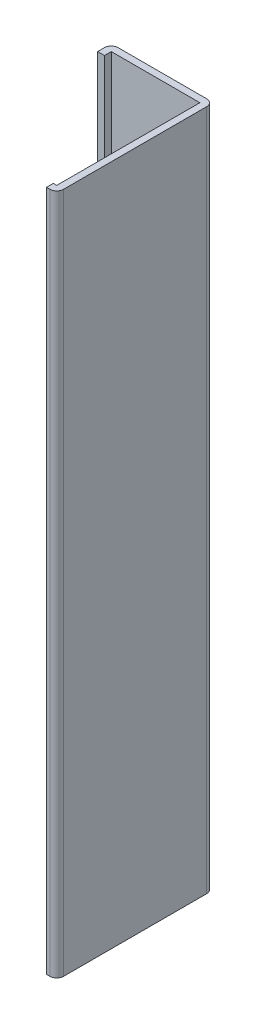
ISO-10303-21;
HEADER;
FILE_DESCRIPTION(('STEP AP214'),'2;1');
FILE_NAME('part.step','',(''),(''),'','','');
FILE_SCHEMA(('AUTOMOTIVE_DESIGN { 1 0 10303 214 1 1 1 1 }'));
ENDSEC;
DATA;
#1=APPLICATION_CONTEXT('core data for automotive mechanical design processes');
#2=APPLICATION_PROTOCOL_DEFINITION('international standard','automotive_design',2000,#1);
#3=PRODUCT_CONTEXT('',#1,'mechanical');
#4=PRODUCT('Part','Part','',(#3));
#5=PRODUCT_RELATED_PRODUCT_CATEGORY('part','',(#4));
#6=PRODUCT_DEFINITION_FORMATION('','',#4);
#7=PRODUCT_DEFINITION_CONTEXT('part definition',#1,'design');
#8=PRODUCT_DEFINITION('design','',#6,#7);
#9=PRODUCT_DEFINITION_SHAPE('','',#8);
#10=(LENGTH_UNIT() NAMED_UNIT(*) SI_UNIT(.MILLI.,.METRE.));
#11=(NAMED_UNIT(*) PLANE_ANGLE_UNIT() SI_UNIT($,.RADIAN.));
#12=(NAMED_UNIT(*) SI_UNIT($,.STERADIAN.) SOLID_ANGLE_UNIT());
#13=UNCERTAINTY_MEASURE_WITH_UNIT(LENGTH_MEASURE(1.E-05),#10,'distance_accuracy_value','');
#14=(GEOMETRIC_REPRESENTATION_CONTEXT(3) GLOBAL_UNCERTAINTY_ASSIGNED_CONTEXT((#13)) GLOBAL_UNIT_ASSIGNED_CONTEXT((#10,
#11,#12)) REPRESENTATION_CONTEXT('',''));
#15=CARTESIAN_POINT('',(0.,0.,0.));
#16=DIRECTION('',(0.,0.,1.));
#17=DIRECTION('',(1.,0.,0.));
#18=AXIS2_PLACEMENT_3D('',#15,#16,#17);
#19=CARTESIAN_POINT('',(-6.9088,-2.54,0.));
#20=DIRECTION('',(0.,0.,1.));
#21=DIRECTION('',(1.,0.,0.));
#22=AXIS2_PLACEMENT_3D('',#19,#20,#21);
#23=PLANE('',#22);
#24=DIRECTION('',(0.,-1.,0.));
#25=VECTOR('',#24,1.);
#26=CARTESIAN_POINT('',(-7.5692,-2.54,0.));
#27=LINE('',#26,#25);
#28=CARTESIAN_POINT('',(-7.5692,2.54,0.));
#29=VERTEX_POINT('',#28);
#30=CARTESIAN_POINT('',(-7.5692,-2.54,0.));
#31=VERTEX_POINT('',#30);
#32=EDGE_CURVE('E134',#29,#31,#27,.T.);
#33=ORIENTED_EDGE('',*,*,#32,.F.);
#34=DIRECTION('',(1.,0.,0.));
#35=VECTOR('',#34,1.);
#36=CARTESIAN_POINT('',(-6.9088,2.54,0.));
#37=LINE('',#36,#35);
#38=CARTESIAN_POINT('',(-6.9088,2.54,0.));
#39=VERTEX_POINT('',#38);
#40=EDGE_CURVE('E140',#39,#29,#37,.F.);
#41=ORIENTED_EDGE('',*,*,#40,.F.);
#42=DIRECTION('',(0.,-1.,0.));
#43=VECTOR('',#42,1.);
#44=CARTESIAN_POINT('',(-6.9088,-2.54,0.));
#45=LINE('',#44,#43);
#46=CARTESIAN_POINT('',(-6.9088,-2.54,0.));
#47=VERTEX_POINT('',#46);
#48=EDGE_CURVE('E119',#47,#39,#45,.F.);
#49=ORIENTED_EDGE('',*,*,#48,.F.);
#50=DIRECTION('',(1.,0.,0.));
#51=VECTOR('',#50,1.);
#52=CARTESIAN_POINT('',(-6.9088,-2.54,0.));
#53=LINE('',#52,#51);
#54=EDGE_CURVE('E114',#31,#47,#53,.T.);
#55=ORIENTED_EDGE('',*,*,#54,.F.);
#56=EDGE_LOOP('',(#33,#41,#49,#55));
#57=FACE_BOUND('',#56,.T.);
#58=ADVANCED_FACE('F17',(#57),#23,.F.);
#59=CARTESIAN_POINT('',(-6.9088,-2.54,0.0508));
#60=DIRECTION('',(0.,-1.,0.));
#61=DIRECTION('',(0.,0.,-1.));
#62=AXIS2_PLACEMENT_3D('',#59,#60,#61);
#63=CYLINDRICAL_SURFACE('',#62,0.0508);
#64=CARTESIAN_POINT('',(-6.9088,2.54,0.0508));
#65=DIRECTION('',(0.,-1.,0.));
#66=DIRECTION('',(0.,0.,-1.));
#67=AXIS2_PLACEMENT_3D('',#64,#65,#66);
#68=CIRCLE('',#67,0.0508);
#69=CARTESIAN_POINT('',(-6.858,2.54,0.0508));
#70=VERTEX_POINT('',#69);
#71=EDGE_CURVE('E131',#39,#70,#68,.T.);
#72=ORIENTED_EDGE('',*,*,#71,.T.);
#73=DIRECTION('',(0.,1.,0.));
#74=VECTOR('',#73,1.);
#75=CARTESIAN_POINT('',(-6.858,-2.54,0.0507999999999999));
#76=LINE('',#75,#74);
#77=CARTESIAN_POINT('',(-6.858,-2.54,0.0508));
#78=VERTEX_POINT('',#77);
#79=EDGE_CURVE('E123',#70,#78,#76,.F.);
#80=ORIENTED_EDGE('',*,*,#79,.T.);
#81=CARTESIAN_POINT('',(-6.9088,-2.54,0.0508));
#82=DIRECTION('',(0.,-1.,0.));
#83=DIRECTION('',(0.,0.,-1.));
#84=AXIS2_PLACEMENT_3D('',#81,#82,#83);
#85=CIRCLE('',#84,0.0508);
#86=EDGE_CURVE('E20',#78,#47,#85,.F.);
#87=ORIENTED_EDGE('',*,*,#86,.T.);
#88=ORIENTED_EDGE('',*,*,#48,.T.);
#89=EDGE_LOOP('',(#72,#80,#87,#88));
#90=FACE_BOUND('',#89,.T.);
#91=ADVANCED_FACE('F129',(#90),#63,.T.);
#92=CARTESIAN_POINT('',(-7.5692,-2.54,0.0508));
#93=DIRECTION('',(0.,-1.,0.));
#94=DIRECTION('',(0.,0.,-1.));
#95=AXIS2_PLACEMENT_3D('',#92,#93,#94);
#96=CYLINDRICAL_SURFACE('',#95,0.0508);
#97=CARTESIAN_POINT('',(-7.5692,2.54,0.0508));
#98=DIRECTION('',(0.,-1.,0.));
#99=DIRECTION('',(0.,0.,-1.));
#100=AXIS2_PLACEMENT_3D('',#97,#98,#99);
#101=CIRCLE('',#100,0.0508);
#102=CARTESIAN_POINT('',(-7.62,2.54,0.0508));
#103=VERTEX_POINT('',#102);
#104=EDGE_CURVE('E145',#103,#29,#101,.T.);
#105=ORIENTED_EDGE('',*,*,#104,.T.);
#106=ORIENTED_EDGE('',*,*,#32,.T.);
#107=CARTESIAN_POINT('',(-7.5692,-2.54,0.0508));
#108=DIRECTION('',(0.,-1.,0.));
#109=DIRECTION('',(0.,0.,-1.));
#110=AXIS2_PLACEMENT_3D('',#107,#108,#109);
#111=CIRCLE('',#110,0.0508);
#112=CARTESIAN_POINT('',(-7.62,-2.54,0.0508));
#113=VERTEX_POINT('',#112);
#114=EDGE_CURVE('E155',#31,#113,#111,.F.);
#115=ORIENTED_EDGE('',*,*,#114,.T.);
#116=DIRECTION('',(0.,1.,0.));
#117=VECTOR('',#116,1.);
#118=CARTESIAN_POINT('',(-7.62,-2.54,0.0508));
#119=LINE('',#118,#117);
#120=EDGE_CURVE('E127',#113,#103,#119,.T.);
#121=ORIENTED_EDGE('',*,*,#120,.T.);
#122=EDGE_LOOP('',(#105,#106,#115,#121));
#123=FACE_BOUND('',#122,.T.);
#124=ADVANCED_FACE('F159',(#123),#96,.T.);
#125=CARTESIAN_POINT('',(-6.858,-2.54,1.1176));
#126=DIRECTION('',(-1.,0.,0.));
#127=DIRECTION('',(0.,0.,1.));
#128=AXIS2_PLACEMENT_3D('',#125,#126,#127);
#129=PLANE('',#128);
#130=ORIENTED_EDGE('',*,*,#79,.F.);
#131=DIRECTION('',(0.,0.,1.));
#132=VECTOR('',#131,1.);
#133=CARTESIAN_POINT('',(-6.858,2.54,1.1176));
#134=LINE('',#133,#132);
#135=CARTESIAN_POINT('',(-6.858,2.54,1.1176));
#136=VERTEX_POINT('',#135);
#137=EDGE_CURVE('E132',#136,#70,#134,.F.);
#138=ORIENTED_EDGE('',*,*,#137,.F.);
#139=DIRECTION('',(0.,-1.,0.));
#140=VECTOR('',#139,1.);
#141=CARTESIAN_POINT('',(-6.858,-2.54,1.1176));
#142=LINE('',#141,#140);
#143=CARTESIAN_POINT('',(-6.858,-2.54,1.1176));
#144=VERTEX_POINT('',#143);
#145=EDGE_CURVE('E126',#144,#136,#142,.F.);
#146=ORIENTED_EDGE('',*,*,#145,.F.);
#147=DIRECTION('',(0.,0.,1.));
#148=VECTOR('',#147,1.);
#149=CARTESIAN_POINT('',(-6.858,-2.54,1.1176));
#150=LINE('',#149,#148);
#151=EDGE_CURVE('E111',#78,#144,#150,.T.);
#152=ORIENTED_EDGE('',*,*,#151,.F.);
#153=EDGE_LOOP('',(#130,#138,#146,#152));
#154=FACE_BOUND('',#153,.T.);
#155=ADVANCED_FACE('F122',(#154),#129,.F.);
#156=CARTESIAN_POINT('',(-7.62,-2.54,0.0508));
#157=DIRECTION('',(1.,0.,0.));
#158=DIRECTION('',(0.,0.,-1.));
#159=AXIS2_PLACEMENT_3D('',#156,#157,#158);
#160=PLANE('',#159);
#161=DIRECTION('',(0.,1.,0.));
#162=VECTOR('',#161,1.);
#163=CARTESIAN_POINT('',(-7.62,-2.54,0.1016));
#164=LINE('',#163,#162);
#165=CARTESIAN_POINT('',(-7.62,-2.54,0.1016));
#166=VERTEX_POINT('',#165);
#167=CARTESIAN_POINT('',(-7.62,2.54,0.1016));
#168=VERTEX_POINT('',#167);
#169=EDGE_CURVE('E150',#166,#168,#164,.T.);
#170=ORIENTED_EDGE('',*,*,#169,.T.);
#171=DIRECTION('',(0.,0.,-1.));
#172=VECTOR('',#171,1.);
#173=CARTESIAN_POINT('',(-7.62,2.54,0.0508));
#174=LINE('',#173,#172);
#175=EDGE_CURVE('E167',#103,#168,#174,.F.);
#176=ORIENTED_EDGE('',*,*,#175,.F.);
#177=ORIENTED_EDGE('',*,*,#120,.F.);
#178=DIRECTION('',(0.,0.,-1.));
#179=VECTOR('',#178,1.);
#180=CARTESIAN_POINT('',(-7.62,-2.54,0.0508));
#181=LINE('',#180,#179);
#182=EDGE_CURVE('E153',#166,#113,#181,.T.);
#183=ORIENTED_EDGE('',*,*,#182,.F.);
#184=EDGE_LOOP('',(#170,#176,#177,#183));
#185=FACE_BOUND('',#184,.T.);
#186=ADVANCED_FACE('F165',(#185),#160,.F.);
#187=CARTESIAN_POINT('',(-6.9088,-2.54,1.1176));
#188=DIRECTION('',(0.,-1.,0.));
#189=DIRECTION('',(0.,0.,-1.));
#190=AXIS2_PLACEMENT_3D('',#187,#188,#189);
#191=CYLINDRICAL_SURFACE('',#190,0.0508);
#192=CARTESIAN_POINT('',(-6.9088,2.54,1.1176));
#193=DIRECTION('',(0.,-1.,0.));
#194=DIRECTION('',(0.,0.,-1.));
#195=AXIS2_PLACEMENT_3D('',#192,#193,#194);
#196=CIRCLE('',#195,0.0508);
#197=CARTESIAN_POINT('',(-6.9088,2.54,1.1684));
#198=VERTEX_POINT('',#197);
#199=EDGE_CURVE('E148',#136,#198,#196,.T.);
#200=ORIENTED_EDGE('',*,*,#199,.T.);
#201=DIRECTION('',(0.,1.,0.));
#202=VECTOR('',#201,1.);
#203=CARTESIAN_POINT('',(-6.9088,-2.54,1.1684));
#204=LINE('',#203,#202);
#205=CARTESIAN_POINT('',(-6.9088,-2.54,1.1684));
#206=VERTEX_POINT('',#205);
#207=EDGE_CURVE('E181',#206,#198,#204,.T.);
#208=ORIENTED_EDGE('',*,*,#207,.F.);
#209=CARTESIAN_POINT('',(-6.9088,-2.54,1.1176));
#210=DIRECTION('',(0.,-1.,0.));
#211=DIRECTION('',(0.,0.,-1.));
#212=AXIS2_PLACEMENT_3D('',#209,#210,#211);
#213=CIRCLE('',#212,0.0508);
#214=EDGE_CURVE('E151',#206,#144,#213,.F.);
#215=ORIENTED_EDGE('',*,*,#214,.T.);
#216=ORIENTED_EDGE('',*,*,#145,.T.);
#217=EDGE_LOOP('',(#200,#208,#215,#216));
#218=FACE_BOUND('',#217,.T.);
#219=ADVANCED_FACE('F234',(#218),#191,.T.);
#220=CARTESIAN_POINT('',(-7.62,-2.54,0.1016));
#221=DIRECTION('',(0.,0.,-1.));
#222=DIRECTION('',(-1.,0.,0.));
#223=AXIS2_PLACEMENT_3D('',#220,#221,#222);
#224=PLANE('',#223);
#225=DIRECTION('',(0.,1.,0.));
#226=VECTOR('',#225,1.);
#227=CARTESIAN_POINT('',(-7.5692,-2.54,0.1016));
#228=LINE('',#227,#226);
#229=CARTESIAN_POINT('',(-7.5692,-2.54,0.1016));
#230=VERTEX_POINT('',#229);
#231=CARTESIAN_POINT('',(-7.5692,2.54,0.1016));
#232=VERTEX_POINT('',#231);
#233=EDGE_CURVE('E196',#230,#232,#228,.T.);
#234=ORIENTED_EDGE('',*,*,#233,.T.);
#235=DIRECTION('',(-1.,0.,0.));
#236=VECTOR('',#235,1.);
#237=CARTESIAN_POINT('',(-7.62,2.54,0.1016));
#238=LINE('',#237,#236);
#239=EDGE_CURVE('E177',#168,#232,#238,.F.);
#240=ORIENTED_EDGE('',*,*,#239,.F.);
#241=ORIENTED_EDGE('',*,*,#169,.F.);
#242=DIRECTION('',(-1.,0.,0.));
#243=VECTOR('',#242,1.);
#244=CARTESIAN_POINT('',(-7.62,-2.54,0.1016));
#245=LINE('',#244,#243);
#246=EDGE_CURVE('E170',#230,#166,#245,.T.);
#247=ORIENTED_EDGE('',*,*,#246,.F.);
#248=EDGE_LOOP('',(#234,#240,#241,#247));
#249=FACE_BOUND('',#248,.T.);
#250=ADVANCED_FACE('F202',(#249),#224,.F.);
#251=CARTESIAN_POINT('',(-6.9088,-2.54,1.1684));
#252=DIRECTION('',(0.,0.,1.));
#253=DIRECTION('',(1.,0.,0.));
#254=AXIS2_PLACEMENT_3D('',#251,#252,#253);
#255=PLANE('',#254);
#256=DIRECTION('',(0.,1.,0.));
#257=VECTOR('',#256,1.);
#258=CARTESIAN_POINT('',(-6.9342,-2.54,1.1684));
#259=LINE('',#258,#257);
#260=CARTESIAN_POINT('',(-6.9342,2.54,1.1684));
#261=VERTEX_POINT('',#260);
#262=CARTESIAN_POINT('',(-6.9342,-2.54,1.1684));
#263=VERTEX_POINT('',#262);
#264=EDGE_CURVE('E216',#261,#263,#259,.F.);
#265=ORIENTED_EDGE('',*,*,#264,.T.);
#266=DIRECTION('',(1.,0.,0.));
#267=VECTOR('',#266,1.);
#268=CARTESIAN_POINT('',(-6.9088,-2.54,1.1684));
#269=LINE('',#268,#267);
#270=EDGE_CURVE('E203',#263,#206,#269,.T.);
#271=ORIENTED_EDGE('',*,*,#270,.T.);
#272=ORIENTED_EDGE('',*,*,#207,.T.);
#273=DIRECTION('',(1.,0.,0.));
#274=VECTOR('',#273,1.);
#275=CARTESIAN_POINT('',(-6.9088,2.54,1.1684));
#276=LINE('',#275,#274);
#277=EDGE_CURVE('E206',#198,#261,#276,.F.);
#278=ORIENTED_EDGE('',*,*,#277,.T.);
#279=EDGE_LOOP('',(#265,#271,#272,#278));
#280=FACE_BOUND('',#279,.T.);
#281=ADVANCED_FACE('F240',(#280),#255,.T.);
#282=CARTESIAN_POINT('',(-7.5692,-2.54,0.1016));
#283=DIRECTION('',(-1.,0.,0.));
#284=DIRECTION('',(0.,0.,1.));
#285=AXIS2_PLACEMENT_3D('',#282,#283,#284);
#286=PLANE('',#285);
#287=DIRECTION('',(0.,1.,0.));
#288=VECTOR('',#287,1.);
#289=CARTESIAN_POINT('',(-7.5692,-2.54,0.0508));
#290=LINE('',#289,#288);
#291=CARTESIAN_POINT('',(-7.5692,-2.54,0.0508));
#292=VERTEX_POINT('',#291);
#293=CARTESIAN_POINT('',(-7.5692,2.54,0.0508));
#294=VERTEX_POINT('',#293);
#295=EDGE_CURVE('E198',#292,#294,#290,.T.);
#296=ORIENTED_EDGE('',*,*,#295,.T.);
#297=DIRECTION('',(0.,0.,1.));
#298=VECTOR('',#297,1.);
#299=CARTESIAN_POINT('',(-7.5692,2.54,0.1016));
#300=LINE('',#299,#298);
#301=EDGE_CURVE('E189',#232,#294,#300,.F.);
#302=ORIENTED_EDGE('',*,*,#301,.F.);
#303=ORIENTED_EDGE('',*,*,#233,.F.);
#304=DIRECTION('',(0.,0.,1.));
#305=VECTOR('',#304,1.);
#306=CARTESIAN_POINT('',(-7.5692,-2.54,0.1016));
#307=LINE('',#306,#305);
#308=EDGE_CURVE('E200',#292,#230,#307,.T.);
#309=ORIENTED_EDGE('',*,*,#308,.F.);
#310=EDGE_LOOP('',(#296,#302,#303,#309));
#311=FACE_BOUND('',#310,.T.);
#312=ADVANCED_FACE('F195',(#311),#286,.F.);
#313=CARTESIAN_POINT('',(-6.9342,-2.54,1.1176));
#314=DIRECTION('',(1.,0.,0.));
#315=DIRECTION('',(0.,0.,-1.));
#316=AXIS2_PLACEMENT_3D('',#313,#314,#315);
#317=PLANE('',#316);
#318=ORIENTED_EDGE('',*,*,#264,.F.);
#319=DIRECTION('',(0.,0.,1.));
#320=VECTOR('',#319,1.);
#321=CARTESIAN_POINT('',(-6.9342,2.54,0.0508));
#322=LINE('',#321,#320);
#323=CARTESIAN_POINT('',(-6.9342,2.54,1.1176));
#324=VERTEX_POINT('',#323);
#325=EDGE_CURVE('E226',#324,#261,#322,.T.);
#326=ORIENTED_EDGE('',*,*,#325,.F.);
#327=DIRECTION('',(0.,1.,0.));
#328=VECTOR('',#327,1.);
#329=CARTESIAN_POINT('',(-6.9342,-2.54,1.1176));
#330=LINE('',#329,#328);
#331=CARTESIAN_POINT('',(-6.9342,-2.54,1.1176));
#332=VERTEX_POINT('',#331);
#333=EDGE_CURVE('E246',#324,#332,#330,.F.);
#334=ORIENTED_EDGE('',*,*,#333,.T.);
#335=DIRECTION('',(0.,0.,-1.));
#336=VECTOR('',#335,1.);
#337=CARTESIAN_POINT('',(-6.9342,-2.54,1.1176));
#338=LINE('',#337,#336);
#339=EDGE_CURVE('E214',#263,#332,#338,.T.);
#340=ORIENTED_EDGE('',*,*,#339,.F.);
#341=EDGE_LOOP('',(#318,#326,#334,#340));
#342=FACE_BOUND('',#341,.T.);
#343=ADVANCED_FACE('F243',(#342),#317,.F.);
#344=CARTESIAN_POINT('',(-7.5692,-2.54,0.0508));
#345=DIRECTION('',(0.,0.,-1.));
#346=DIRECTION('',(-1.,0.,0.));
#347=AXIS2_PLACEMENT_3D('',#344,#345,#346);
#348=PLANE('',#347);
#349=DIRECTION('',(0.,1.,0.));
#350=VECTOR('',#349,1.);
#351=CARTESIAN_POINT('',(-6.9088,-2.54,0.0508));
#352=LINE('',#351,#350);
#353=CARTESIAN_POINT('',(-6.9088,-2.54,0.0508));
#354=VERTEX_POINT('',#353);
#355=CARTESIAN_POINT('',(-6.9088,2.54,0.0508));
#356=VERTEX_POINT('',#355);
#357=EDGE_CURVE('E256',#354,#356,#352,.T.);
#358=ORIENTED_EDGE('',*,*,#357,.T.);
#359=DIRECTION('',(1.,0.,0.));
#360=VECTOR('',#359,1.);
#361=CARTESIAN_POINT('',(-6.9088,2.54,0.0508));
#362=LINE('',#361,#360);
#363=EDGE_CURVE('E229',#294,#356,#362,.T.);
#364=ORIENTED_EDGE('',*,*,#363,.F.);
#365=ORIENTED_EDGE('',*,*,#295,.F.);
#366=DIRECTION('',(1.,0.,0.));
#367=VECTOR('',#366,1.);
#368=CARTESIAN_POINT('',(-6.9088,-2.54,0.0508));
#369=LINE('',#368,#367);
#370=EDGE_CURVE('E253',#292,#354,#369,.T.);
#371=ORIENTED_EDGE('',*,*,#370,.T.);
#372=EDGE_LOOP('',(#358,#364,#365,#371));
#373=FACE_BOUND('',#372,.T.);
#374=ADVANCED_FACE('F265',(#373),#348,.F.);
#375=CARTESIAN_POINT('',(-6.9088,2.54,0.0508));
#376=DIRECTION('',(0.,1.,0.));
#377=DIRECTION('',(0.,0.,1.));
#378=AXIS2_PLACEMENT_3D('',#375,#376,#377);
#379=PLANE('',#378);
#380=ORIENTED_EDGE('',*,*,#301,.T.);
#381=ORIENTED_EDGE('',*,*,#363,.T.);
#382=DIRECTION('',(0.,0.,-1.));
#383=VECTOR('',#382,1.);
#384=CARTESIAN_POINT('',(-6.9088,2.54,0.0508));
#385=LINE('',#384,#383);
#386=CARTESIAN_POINT('',(-6.9088,2.54,1.1176));
#387=VERTEX_POINT('',#386);
#388=EDGE_CURVE('E268',#356,#387,#385,.F.);
#389=ORIENTED_EDGE('',*,*,#388,.T.);
#390=DIRECTION('',(1.,0.,0.));
#391=VECTOR('',#390,1.);
#392=CARTESIAN_POINT('',(-6.9088,2.54,1.1176));
#393=LINE('',#392,#391);
#394=EDGE_CURVE('E248',#387,#324,#393,.F.);
#395=ORIENTED_EDGE('',*,*,#394,.T.);
#396=ORIENTED_EDGE('',*,*,#325,.T.);
#397=ORIENTED_EDGE('',*,*,#277,.F.);
#398=ORIENTED_EDGE('',*,*,#199,.F.);
#399=ORIENTED_EDGE('',*,*,#137,.T.);
#400=ORIENTED_EDGE('',*,*,#71,.F.);
#401=ORIENTED_EDGE('',*,*,#40,.T.);
#402=ORIENTED_EDGE('',*,*,#104,.F.);
#403=ORIENTED_EDGE('',*,*,#175,.T.);
#404=ORIENTED_EDGE('',*,*,#239,.T.);
#405=EDGE_LOOP('',(#380,#381,#389,#395,#396,#397,#398,#399,#400,#401,#402,#403,#404));
#406=FACE_BOUND('',#405,.T.);
#407=ADVANCED_FACE('F188',(#406),#379,.T.);
#408=CARTESIAN_POINT('',(-6.9088,-2.54,1.1176));
#409=DIRECTION('',(0.,0.,1.));
#410=DIRECTION('',(1.,0.,0.));
#411=AXIS2_PLACEMENT_3D('',#408,#409,#410);
#412=PLANE('',#411);
#413=ORIENTED_EDGE('',*,*,#333,.F.);
#414=ORIENTED_EDGE('',*,*,#394,.F.);
#415=DIRECTION('',(0.,1.,0.));
#416=VECTOR('',#415,1.);
#417=CARTESIAN_POINT('',(-6.9088,-2.54,1.1176));
#418=LINE('',#417,#416);
#419=CARTESIAN_POINT('',(-6.9088,-2.54,1.1176));
#420=VERTEX_POINT('',#419);
#421=EDGE_CURVE('E26',#387,#420,#418,.F.);
#422=ORIENTED_EDGE('',*,*,#421,.T.);
#423=DIRECTION('',(1.,0.,0.));
#424=VECTOR('',#423,1.);
#425=CARTESIAN_POINT('',(-6.9088,-2.54,1.1176));
#426=LINE('',#425,#424);
#427=EDGE_CURVE('E34',#420,#332,#426,.F.);
#428=ORIENTED_EDGE('',*,*,#427,.T.);
#429=EDGE_LOOP('',(#413,#414,#422,#428));
#430=FACE_BOUND('',#429,.T.);
#431=ADVANCED_FACE('F251',(#430),#412,.F.);
#432=CARTESIAN_POINT('',(-6.9088,-2.54,0.0508));
#433=DIRECTION('',(0.,1.,0.));
#434=DIRECTION('',(0.,0.,1.));
#435=AXIS2_PLACEMENT_3D('',#432,#433,#434);
#436=PLANE('',#435);
#437=ORIENTED_EDGE('',*,*,#308,.T.);
#438=ORIENTED_EDGE('',*,*,#246,.T.);
#439=ORIENTED_EDGE('',*,*,#182,.T.);
#440=ORIENTED_EDGE('',*,*,#114,.F.);
#441=ORIENTED_EDGE('',*,*,#54,.T.);
#442=ORIENTED_EDGE('',*,*,#86,.F.);
#443=ORIENTED_EDGE('',*,*,#151,.T.);
#444=ORIENTED_EDGE('',*,*,#214,.F.);
#445=ORIENTED_EDGE('',*,*,#270,.F.);
#446=ORIENTED_EDGE('',*,*,#339,.T.);
#447=ORIENTED_EDGE('',*,*,#427,.F.);
#448=DIRECTION('',(0.,0.,-1.));
#449=VECTOR('',#448,1.);
#450=CARTESIAN_POINT('',(-6.9088,-2.54,0.0508));
#451=LINE('',#450,#449);
#452=EDGE_CURVE('E11',#420,#354,#451,.T.);
#453=ORIENTED_EDGE('',*,*,#452,.T.);
#454=ORIENTED_EDGE('',*,*,#370,.F.);
#455=EDGE_LOOP('',(#437,#438,#439,#440,#441,#442,#443,#444,#445,#446,#447,#453,#454));
#456=FACE_BOUND('',#455,.T.);
#457=ADVANCED_FACE('F110',(#456),#436,.F.);
#458=CARTESIAN_POINT('',(-6.9088,-2.54,0.0508));
#459=DIRECTION('',(1.,0.,0.));
#460=DIRECTION('',(0.,0.,-1.));
#461=AXIS2_PLACEMENT_3D('',#458,#459,#460);
#462=PLANE('',#461);
#463=ORIENTED_EDGE('',*,*,#421,.F.);
#464=ORIENTED_EDGE('',*,*,#388,.F.);
#465=ORIENTED_EDGE('',*,*,#357,.F.);
#466=ORIENTED_EDGE('',*,*,#452,.F.);
#467=EDGE_LOOP('',(#463,#464,#465,#466));
#468=FACE_BOUND('',#467,.T.);
#469=ADVANCED_FACE('F270',(#468),#462,.F.);
#470=CLOSED_SHELL('',(#58,#91,#124,#155,#186,#219,#250,#281,#312,#343,#374,#407,#431,#457,#469));
#471=MANIFOLD_SOLID_BREP('B1',#470);
#472=ADVANCED_BREP_SHAPE_REPRESENTATION('',(#18,#471),#14);
#473=SHAPE_DEFINITION_REPRESENTATION(#9,#472);
ENDSEC;
END-ISO-10303-21;
